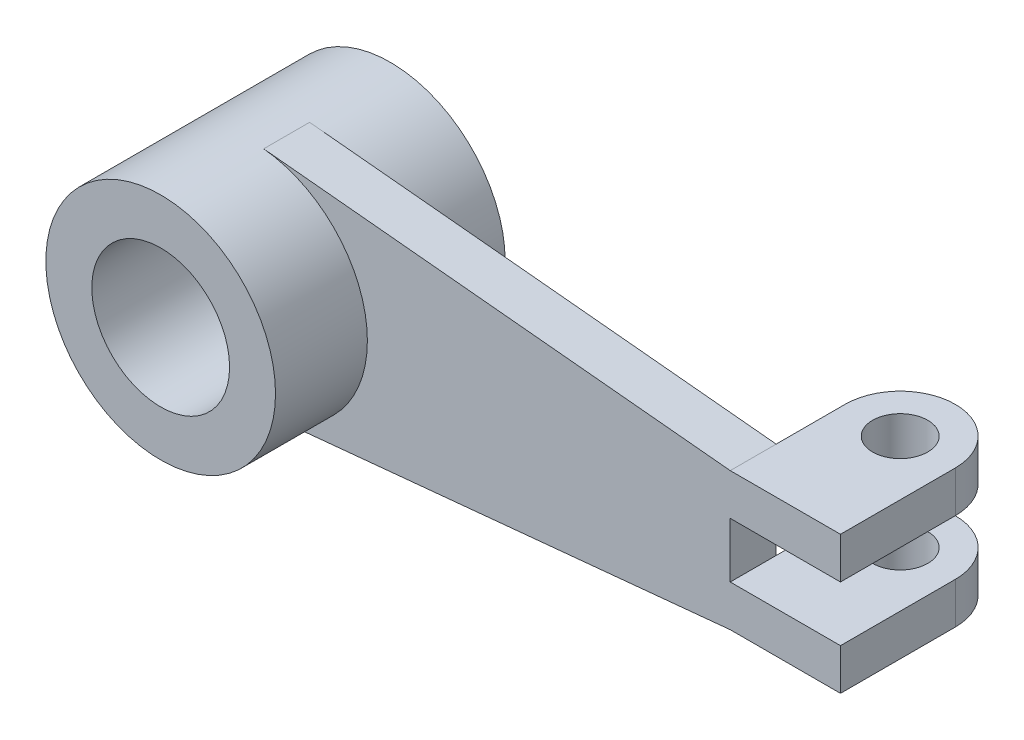
ISO-10303-21;
HEADER;
FILE_DESCRIPTION(('STEP AP214'),'2;1');
FILE_NAME('part.step','',(''),(''),'','','');
FILE_SCHEMA(('AUTOMOTIVE_DESIGN { 1 0 10303 214 1 1 1 1 }'));
ENDSEC;
DATA;
#1=APPLICATION_CONTEXT('core data for automotive mechanical design processes');
#2=APPLICATION_PROTOCOL_DEFINITION('international standard','automotive_design',2000,#1);
#3=PRODUCT_CONTEXT('',#1,'mechanical');
#4=PRODUCT('Part','Part','',(#3));
#5=PRODUCT_RELATED_PRODUCT_CATEGORY('part','',(#4));
#6=PRODUCT_DEFINITION_FORMATION('','',#4);
#7=PRODUCT_DEFINITION_CONTEXT('part definition',#1,'design');
#8=PRODUCT_DEFINITION('design','',#6,#7);
#9=PRODUCT_DEFINITION_SHAPE('','',#8);
#10=(LENGTH_UNIT() NAMED_UNIT(*) SI_UNIT(.MILLI.,.METRE.));
#11=(NAMED_UNIT(*) PLANE_ANGLE_UNIT() SI_UNIT($,.RADIAN.));
#12=(NAMED_UNIT(*) SI_UNIT($,.STERADIAN.) SOLID_ANGLE_UNIT());
#13=UNCERTAINTY_MEASURE_WITH_UNIT(LENGTH_MEASURE(1.E-05),#10,'distance_accuracy_value','');
#14=(GEOMETRIC_REPRESENTATION_CONTEXT(3) GLOBAL_UNCERTAINTY_ASSIGNED_CONTEXT((#13)) GLOBAL_UNIT_ASSIGNED_CONTEXT((#10,
#11,#12)) REPRESENTATION_CONTEXT('',''));
#15=CARTESIAN_POINT('',(0.,0.,0.));
#16=DIRECTION('',(0.,0.,1.));
#17=DIRECTION('',(1.,0.,0.));
#18=AXIS2_PLACEMENT_3D('',#15,#16,#17);
#19=CARTESIAN_POINT('',(104.,15.,-5.));
#20=DIRECTION('',(-1.,0.,0.));
#21=DIRECTION('',(0.,0.,1.));
#22=AXIS2_PLACEMENT_3D('',#19,#20,#21);
#23=PLANE('',#22);
#24=DIRECTION('',(0.,0.,1.));
#25=VECTOR('',#24,1.);
#26=CARTESIAN_POINT('',(104.,-6.,5.));
#27=LINE('',#26,#25);
#28=CARTESIAN_POINT('',(104.,-5.99999999999999,-5.));
#29=VERTEX_POINT('',#28);
#30=CARTESIAN_POINT('',(104.,-5.99999999999999,5.));
#31=VERTEX_POINT('',#30);
#32=EDGE_CURVE('E63',#29,#31,#27,.T.);
#33=ORIENTED_EDGE('',*,*,#32,.F.);
#34=DIRECTION('',(0.,-1.,0.));
#35=VECTOR('',#34,1.);
#36=CARTESIAN_POINT('',(104.,15.,-5.));
#37=LINE('',#36,#35);
#38=CARTESIAN_POINT('',(104.,6.,-5.));
#39=VERTEX_POINT('',#38);
#40=EDGE_CURVE('E237',#39,#29,#37,.T.);
#41=ORIENTED_EDGE('',*,*,#40,.F.);
#42=DIRECTION('',(0.,0.,1.));
#43=VECTOR('',#42,1.);
#44=CARTESIAN_POINT('',(104.,6.,5.));
#45=LINE('',#44,#43);
#46=CARTESIAN_POINT('',(104.,6.,5.));
#47=VERTEX_POINT('',#46);
#48=EDGE_CURVE('E205',#39,#47,#45,.T.);
#49=ORIENTED_EDGE('',*,*,#48,.T.);
#50=DIRECTION('',(0.,-1.,0.));
#51=VECTOR('',#50,1.);
#52=CARTESIAN_POINT('',(104.,15.,5.));
#53=LINE('',#52,#51);
#54=EDGE_CURVE('E68',#47,#31,#53,.T.);
#55=ORIENTED_EDGE('',*,*,#54,.T.);
#56=EDGE_LOOP('',(#33,#41,#49,#55));
#57=FACE_BOUND('',#56,.T.);
#58=ADVANCED_FACE('F45',(#57),#23,.F.);
#59=CARTESIAN_POINT('',(0.,0.,25.));
#60=DIRECTION('',(0.,0.,1.));
#61=DIRECTION('',(1.,0.,0.));
#62=AXIS2_PLACEMENT_3D('',#59,#60,#61);
#63=PLANE('',#62);
#64=CARTESIAN_POINT('',(0.,0.,25.));
#65=DIRECTION('',(0.,0.,1.));
#66=DIRECTION('',(1.,0.,0.));
#67=AXIS2_PLACEMENT_3D('',#64,#65,#66);
#68=CIRCLE('',#67,25.);
#69=CARTESIAN_POINT('',(25.,0.,25.));
#70=VERTEX_POINT('',#69);
#71=EDGE_CURVE('E11',#70,#70,#68,.T.);
#72=ORIENTED_EDGE('',*,*,#71,.T.);
#73=EDGE_LOOP('',(#72));
#74=FACE_BOUND('',#73,.T.);
#75=CARTESIAN_POINT('',(0.,0.,25.));
#76=DIRECTION('',(0.,0.,1.));
#77=DIRECTION('',(1.,0.,0.));
#78=AXIS2_PLACEMENT_3D('',#75,#76,#77);
#79=CIRCLE('',#78,15.);
#80=CARTESIAN_POINT('',(15.,0.,25.));
#81=VERTEX_POINT('',#80);
#82=EDGE_CURVE('E277',#81,#81,#79,.T.);
#83=ORIENTED_EDGE('',*,*,#82,.F.);
#84=EDGE_LOOP('',(#83));
#85=FACE_BOUND('',#84,.T.);
#86=ADVANCED_FACE('F291',(#74,#85),#63,.T.);
#87=CARTESIAN_POINT('',(0.,0.,-25.));
#88=DIRECTION('',(0.,0.,1.));
#89=DIRECTION('',(1.,0.,0.));
#90=AXIS2_PLACEMENT_3D('',#87,#88,#89);
#91=PLANE('',#90);
#92=CARTESIAN_POINT('',(0.,0.,-25.));
#93=DIRECTION('',(0.,0.,1.));
#94=DIRECTION('',(1.,0.,0.));
#95=AXIS2_PLACEMENT_3D('',#92,#93,#94);
#96=CIRCLE('',#95,25.);
#97=CARTESIAN_POINT('',(25.,0.,-25.));
#98=VERTEX_POINT('',#97);
#99=EDGE_CURVE('E55',#98,#98,#96,.T.);
#100=ORIENTED_EDGE('',*,*,#99,.F.);
#101=EDGE_LOOP('',(#100));
#102=FACE_BOUND('',#101,.T.);
#103=CARTESIAN_POINT('',(0.,0.,-25.));
#104=DIRECTION('',(0.,0.,1.));
#105=DIRECTION('',(1.,0.,0.));
#106=AXIS2_PLACEMENT_3D('',#103,#104,#105);
#107=CIRCLE('',#106,15.);
#108=CARTESIAN_POINT('',(15.,0.,-25.));
#109=VERTEX_POINT('',#108);
#110=EDGE_CURVE('E276',#109,#109,#107,.T.);
#111=ORIENTED_EDGE('',*,*,#110,.T.);
#112=EDGE_LOOP('',(#111));
#113=FACE_BOUND('',#112,.T.);
#114=ADVANCED_FACE('F288',(#102,#113),#91,.F.);
#115=CARTESIAN_POINT('',(0.,0.,25.));
#116=DIRECTION('',(0.,0.,-1.));
#117=DIRECTION('',(-1.,0.,0.));
#118=AXIS2_PLACEMENT_3D('',#115,#116,#117);
#119=CYLINDRICAL_SURFACE('',#118,25.);
#120=DIRECTION('',(0.,0.,1.));
#121=VECTOR('',#120,1.);
#122=CARTESIAN_POINT('',(2.4207904658528,24.8825194367539,-5.));
#123=LINE('',#122,#121);
#124=CARTESIAN_POINT('',(2.4207904658528,24.8825194367539,-5.));
#125=VERTEX_POINT('',#124);
#126=CARTESIAN_POINT('',(2.4207904658528,24.8825194367539,5.));
#127=VERTEX_POINT('',#126);
#128=EDGE_CURVE('E251',#125,#127,#123,.T.);
#129=ORIENTED_EDGE('',*,*,#128,.F.);
#130=CARTESIAN_POINT('',(0.,0.,-5.));
#131=DIRECTION('',(0.,0.,1.));
#132=DIRECTION('',(-1.,0.,0.));
#133=AXIS2_PLACEMENT_3D('',#130,#131,#132);
#134=CIRCLE('',#133,25.);
#135=CARTESIAN_POINT('',(2.4207904658528,-24.8825194367539,-5.));
#136=VERTEX_POINT('',#135);
#137=EDGE_CURVE('E247',#136,#125,#134,.T.);
#138=ORIENTED_EDGE('',*,*,#137,.F.);
#139=DIRECTION('',(0.,0.,1.));
#140=VECTOR('',#139,1.);
#141=CARTESIAN_POINT('',(2.42079046585281,-24.8825194367539,-5.));
#142=LINE('',#141,#140);
#143=CARTESIAN_POINT('',(2.42079046585281,-24.8825194367539,5.));
#144=VERTEX_POINT('',#143);
#145=EDGE_CURVE('E265',#136,#144,#142,.T.);
#146=ORIENTED_EDGE('',*,*,#145,.T.);
#147=CARTESIAN_POINT('',(0.,0.,5.));
#148=DIRECTION('',(0.,0.,1.));
#149=DIRECTION('',(-1.,0.,0.));
#150=AXIS2_PLACEMENT_3D('',#147,#148,#149);
#151=CIRCLE('',#150,25.);
#152=EDGE_CURVE('E238',#144,#127,#151,.T.);
#153=ORIENTED_EDGE('',*,*,#152,.T.);
#154=EDGE_LOOP('',(#129,#138,#146,#153));
#155=FACE_BOUND('',#154,.T.);
#156=ORIENTED_EDGE('',*,*,#71,.F.);
#157=EDGE_LOOP('',(#156));
#158=FACE_BOUND('',#157,.T.);
#159=ORIENTED_EDGE('',*,*,#99,.T.);
#160=EDGE_LOOP('',(#159));
#161=FACE_BOUND('',#160,.T.);
#162=ADVANCED_FACE('F47',(#155,#158,#161),#119,.T.);
#163=CARTESIAN_POINT('',(0.,0.,25.));
#164=DIRECTION('',(0.,0.,-1.));
#165=DIRECTION('',(-1.,0.,0.));
#166=AXIS2_PLACEMENT_3D('',#163,#164,#165);
#167=CYLINDRICAL_SURFACE('',#166,15.);
#168=ORIENTED_EDGE('',*,*,#82,.T.);
#169=EDGE_LOOP('',(#168));
#170=FACE_BOUND('',#169,.T.);
#171=ORIENTED_EDGE('',*,*,#110,.F.);
#172=EDGE_LOOP('',(#171));
#173=FACE_BOUND('',#172,.T.);
#174=ADVANCED_FACE('F294',(#170,#173),#167,.F.);
#175=CARTESIAN_POINT('',(104.,15.,-5.));
#176=DIRECTION('',(-0.0968316186341122,-0.995300777470156,0.));
#177=DIRECTION('',(0.995300777470156,-0.0968316186341122,0.));
#178=AXIS2_PLACEMENT_3D('',#175,#176,#177);
#179=PLANE('',#178);
#180=DIRECTION('',(0.995300777470156,-0.0968316186341122,0.));
#181=VECTOR('',#180,1.);
#182=CARTESIAN_POINT('',(104.,15.,5.));
#183=LINE('',#182,#181);
#184=CARTESIAN_POINT('',(104.,15.,5.));
#185=VERTEX_POINT('',#184);
#186=EDGE_CURVE('E228',#127,#185,#183,.T.);
#187=ORIENTED_EDGE('',*,*,#186,.T.);
#188=DIRECTION('',(0.,0.,1.));
#189=VECTOR('',#188,1.);
#190=CARTESIAN_POINT('',(104.,15.,-5.));
#191=LINE('',#190,#189);
#192=CARTESIAN_POINT('',(104.,15.,-5.));
#193=VERTEX_POINT('',#192);
#194=EDGE_CURVE('E272',#193,#185,#191,.T.);
#195=ORIENTED_EDGE('',*,*,#194,.F.);
#196=DIRECTION('',(0.995300777470156,-0.0968316186341122,0.));
#197=VECTOR('',#196,1.);
#198=CARTESIAN_POINT('',(104.,15.,-5.));
#199=LINE('',#198,#197);
#200=EDGE_CURVE('E234',#125,#193,#199,.T.);
#201=ORIENTED_EDGE('',*,*,#200,.F.);
#202=ORIENTED_EDGE('',*,*,#128,.T.);
#203=EDGE_LOOP('',(#187,#195,#201,#202));
#204=FACE_BOUND('',#203,.T.);
#205=ADVANCED_FACE('F296',(#204),#179,.F.);
#206=CARTESIAN_POINT('',(104.,-15.,-5.));
#207=DIRECTION('',(-0.096831618634112,0.995300777470156,0.));
#208=DIRECTION('',(-0.995300777470156,-0.096831618634112,0.));
#209=AXIS2_PLACEMENT_3D('',#206,#207,#208);
#210=PLANE('',#209);
#211=DIRECTION('',(-0.995300777470156,-0.0968316186341119,0.));
#212=VECTOR('',#211,1.);
#213=CARTESIAN_POINT('',(104.,-15.,5.));
#214=LINE('',#213,#212);
#215=CARTESIAN_POINT('',(104.,-15.,5.));
#216=VERTEX_POINT('',#215);
#217=EDGE_CURVE('E256',#216,#144,#214,.T.);
#218=ORIENTED_EDGE('',*,*,#217,.T.);
#219=ORIENTED_EDGE('',*,*,#145,.F.);
#220=DIRECTION('',(-0.995300777470156,-0.0968316186341119,0.));
#221=VECTOR('',#220,1.);
#222=CARTESIAN_POINT('',(104.,-15.,-5.));
#223=LINE('',#222,#221);
#224=CARTESIAN_POINT('',(104.,-15.,-5.));
#225=VERTEX_POINT('',#224);
#226=EDGE_CURVE('E243',#225,#136,#223,.T.);
#227=ORIENTED_EDGE('',*,*,#226,.F.);
#228=DIRECTION('',(0.,0.,1.));
#229=VECTOR('',#228,1.);
#230=CARTESIAN_POINT('',(104.,-15.,-5.));
#231=LINE('',#230,#229);
#232=EDGE_CURVE('E268',#225,#216,#231,.T.);
#233=ORIENTED_EDGE('',*,*,#232,.T.);
#234=EDGE_LOOP('',(#218,#219,#227,#233));
#235=FACE_BOUND('',#234,.T.);
#236=ADVANCED_FACE('F303',(#235),#210,.F.);
#237=CARTESIAN_POINT('',(0.,0.,-5.));
#238=DIRECTION('',(0.,0.,-1.));
#239=DIRECTION('',(-1.,0.,0.));
#240=AXIS2_PLACEMENT_3D('',#237,#238,#239);
#241=PLANE('',#240);
#242=ORIENTED_EDGE('',*,*,#200,.T.);
#243=EDGE_CURVE('E239',#193,#39,#37,.T.);
#244=ORIENTED_EDGE('',*,*,#243,.T.);
#245=ORIENTED_EDGE('',*,*,#40,.T.);
#246=DIRECTION('',(0.,-1.,0.));
#247=VECTOR('',#246,1.);
#248=CARTESIAN_POINT('',(104.,0.,-5.));
#249=LINE('',#248,#247);
#250=EDGE_CURVE('E160',#29,#225,#249,.T.);
#251=ORIENTED_EDGE('',*,*,#250,.T.);
#252=ORIENTED_EDGE('',*,*,#226,.T.);
#253=ORIENTED_EDGE('',*,*,#137,.T.);
#254=EDGE_LOOP('',(#242,#244,#245,#251,#252,#253));
#255=FACE_BOUND('',#254,.T.);
#256=ADVANCED_FACE('F318',(#255),#241,.T.);
#257=CARTESIAN_POINT('',(0.,0.,5.));
#258=DIRECTION('',(0.,0.,-1.));
#259=DIRECTION('',(-1.,0.,0.));
#260=AXIS2_PLACEMENT_3D('',#257,#258,#259);
#261=PLANE('',#260);
#262=ORIENTED_EDGE('',*,*,#186,.F.);
#263=ORIENTED_EDGE('',*,*,#152,.F.);
#264=ORIENTED_EDGE('',*,*,#217,.F.);
#265=DIRECTION('',(1.,0.,0.));
#266=VECTOR('',#265,1.);
#267=CARTESIAN_POINT('',(104.,-15.,5.));
#268=LINE('',#267,#266);
#269=CARTESIAN_POINT('',(128.,-15.,5.));
#270=VERTEX_POINT('',#269);
#271=EDGE_CURVE('E170',#216,#270,#268,.T.);
#272=ORIENTED_EDGE('',*,*,#271,.T.);
#273=DIRECTION('',(0.,-1.,0.));
#274=VECTOR('',#273,1.);
#275=CARTESIAN_POINT('',(128.,-6.,5.));
#276=LINE('',#275,#274);
#277=CARTESIAN_POINT('',(128.,-6.,5.));
#278=VERTEX_POINT('',#277);
#279=EDGE_CURVE('E183',#278,#270,#276,.T.);
#280=ORIENTED_EDGE('',*,*,#279,.F.);
#281=DIRECTION('',(1.,0.,0.));
#282=VECTOR('',#281,1.);
#283=CARTESIAN_POINT('',(104.,-6.,5.));
#284=LINE('',#283,#282);
#285=EDGE_CURVE('E164',#31,#278,#284,.T.);
#286=ORIENTED_EDGE('',*,*,#285,.F.);
#287=ORIENTED_EDGE('',*,*,#54,.F.);
#288=DIRECTION('',(1.,0.,0.));
#289=VECTOR('',#288,1.);
#290=CARTESIAN_POINT('',(104.,6.,5.));
#291=LINE('',#290,#289);
#292=CARTESIAN_POINT('',(128.,6.,5.));
#293=VERTEX_POINT('',#292);
#294=EDGE_CURVE('E192',#47,#293,#291,.T.);
#295=ORIENTED_EDGE('',*,*,#294,.T.);
#296=DIRECTION('',(0.,1.,0.));
#297=VECTOR('',#296,1.);
#298=CARTESIAN_POINT('',(128.,6.,5.));
#299=LINE('',#298,#297);
#300=CARTESIAN_POINT('',(128.,15.,5.));
#301=VERTEX_POINT('',#300);
#302=EDGE_CURVE('E210',#293,#301,#299,.T.);
#303=ORIENTED_EDGE('',*,*,#302,.T.);
#304=DIRECTION('',(1.,0.,0.));
#305=VECTOR('',#304,1.);
#306=CARTESIAN_POINT('',(104.,15.,5.));
#307=LINE('',#306,#305);
#308=EDGE_CURVE('E191',#185,#301,#307,.T.);
#309=ORIENTED_EDGE('',*,*,#308,.F.);
#310=EDGE_LOOP('',(#262,#263,#264,#272,#280,#286,#287,#295,#303,#309));
#311=FACE_BOUND('',#310,.T.);
#312=ADVANCED_FACE('F320',(#311),#261,.F.);
#313=CARTESIAN_POINT('',(104.,6.,5.));
#314=DIRECTION('',(-1.,0.,0.));
#315=DIRECTION('',(0.,0.,1.));
#316=AXIS2_PLACEMENT_3D('',#313,#314,#315);
#317=PLANE('',#316);
#318=CARTESIAN_POINT('',(104.,6.,-20.));
#319=VERTEX_POINT('',#318);
#320=EDGE_CURVE('E206',#319,#39,#45,.T.);
#321=ORIENTED_EDGE('',*,*,#320,.T.);
#322=ORIENTED_EDGE('',*,*,#243,.F.);
#323=DIRECTION('',(0.,0.,1.));
#324=VECTOR('',#323,1.);
#325=CARTESIAN_POINT('',(104.,15.,5.));
#326=LINE('',#325,#324);
#327=CARTESIAN_POINT('',(104.,15.,-20.));
#328=VERTEX_POINT('',#327);
#329=EDGE_CURVE('E197',#328,#193,#326,.T.);
#330=ORIENTED_EDGE('',*,*,#329,.F.);
#331=DIRECTION('',(0.,1.,0.));
#332=VECTOR('',#331,1.);
#333=CARTESIAN_POINT('',(104.,6.,-20.));
#334=LINE('',#333,#332);
#335=EDGE_CURVE('E225',#319,#328,#334,.T.);
#336=ORIENTED_EDGE('',*,*,#335,.F.);
#337=EDGE_LOOP('',(#321,#322,#330,#336));
#338=FACE_BOUND('',#337,.T.);
#339=ADVANCED_FACE('F323',(#338),#317,.T.);
#340=CARTESIAN_POINT('',(116.,6.,-20.));
#341=DIRECTION('',(0.,1.,0.));
#342=DIRECTION('',(0.,0.,1.));
#343=AXIS2_PLACEMENT_3D('',#340,#341,#342);
#344=CYLINDRICAL_SURFACE('',#343,12.);
#345=CARTESIAN_POINT('',(116.,15.,-20.));
#346=DIRECTION('',(0.,1.,0.));
#347=DIRECTION('',(0.,0.,1.));
#348=AXIS2_PLACEMENT_3D('',#345,#346,#347);
#349=CIRCLE('',#348,12.);
#350=CARTESIAN_POINT('',(128.,15.,-20.));
#351=VERTEX_POINT('',#350);
#352=EDGE_CURVE('E218',#351,#328,#349,.T.);
#353=ORIENTED_EDGE('',*,*,#352,.F.);
#354=DIRECTION('',(0.,1.,0.));
#355=VECTOR('',#354,1.);
#356=CARTESIAN_POINT('',(128.,6.,-20.));
#357=LINE('',#356,#355);
#358=CARTESIAN_POINT('',(128.,6.,-20.));
#359=VERTEX_POINT('',#358);
#360=EDGE_CURVE('E229',#359,#351,#357,.T.);
#361=ORIENTED_EDGE('',*,*,#360,.F.);
#362=CARTESIAN_POINT('',(116.,6.,-20.));
#363=DIRECTION('',(0.,1.,0.));
#364=DIRECTION('',(0.,0.,1.));
#365=AXIS2_PLACEMENT_3D('',#362,#363,#364);
#366=CIRCLE('',#365,12.);
#367=EDGE_CURVE('E201',#359,#319,#366,.T.);
#368=ORIENTED_EDGE('',*,*,#367,.T.);
#369=ORIENTED_EDGE('',*,*,#335,.T.);
#370=EDGE_LOOP('',(#353,#361,#368,#369));
#371=FACE_BOUND('',#370,.T.);
#372=ADVANCED_FACE('F331',(#371),#344,.T.);
#373=CARTESIAN_POINT('',(128.,6.,5.));
#374=DIRECTION('',(1.,0.,0.));
#375=DIRECTION('',(0.,0.,-1.));
#376=AXIS2_PLACEMENT_3D('',#373,#374,#375);
#377=PLANE('',#376);
#378=DIRECTION('',(0.,0.,-1.));
#379=VECTOR('',#378,1.);
#380=CARTESIAN_POINT('',(128.,15.,5.));
#381=LINE('',#380,#379);
#382=EDGE_CURVE('E214',#301,#351,#381,.T.);
#383=ORIENTED_EDGE('',*,*,#382,.F.);
#384=ORIENTED_EDGE('',*,*,#302,.F.);
#385=DIRECTION('',(0.,0.,-1.));
#386=VECTOR('',#385,1.);
#387=CARTESIAN_POINT('',(128.,6.,5.));
#388=LINE('',#387,#386);
#389=EDGE_CURVE('E196',#293,#359,#388,.T.);
#390=ORIENTED_EDGE('',*,*,#389,.T.);
#391=ORIENTED_EDGE('',*,*,#360,.T.);
#392=EDGE_LOOP('',(#383,#384,#390,#391));
#393=FACE_BOUND('',#392,.T.);
#394=ADVANCED_FACE('F328',(#393),#377,.T.);
#395=CARTESIAN_POINT('',(116.,6.,-20.));
#396=DIRECTION('',(0.,1.,0.));
#397=DIRECTION('',(0.,0.,1.));
#398=AXIS2_PLACEMENT_3D('',#395,#396,#397);
#399=PLANE('',#398);
#400=CARTESIAN_POINT('',(116.,6.,-20.));
#401=DIRECTION('',(0.,1.,0.));
#402=DIRECTION('',(0.,0.,1.));
#403=AXIS2_PLACEMENT_3D('',#400,#401,#402);
#404=CIRCLE('',#403,6.00000000000001);
#405=CARTESIAN_POINT('',(116.,6.,-14.));
#406=VERTEX_POINT('',#405);
#407=EDGE_CURVE('E175',#406,#406,#404,.T.);
#408=ORIENTED_EDGE('',*,*,#407,.T.);
#409=EDGE_LOOP('',(#408));
#410=FACE_BOUND('',#409,.T.);
#411=ORIENTED_EDGE('',*,*,#294,.F.);
#412=ORIENTED_EDGE('',*,*,#48,.F.);
#413=ORIENTED_EDGE('',*,*,#320,.F.);
#414=ORIENTED_EDGE('',*,*,#367,.F.);
#415=ORIENTED_EDGE('',*,*,#389,.F.);
#416=EDGE_LOOP('',(#411,#412,#413,#414,#415));
#417=FACE_BOUND('',#416,.T.);
#418=ADVANCED_FACE('F330',(#410,#417),#399,.F.);
#419=CARTESIAN_POINT('',(116.,15.,-20.));
#420=DIRECTION('',(0.,1.,0.));
#421=DIRECTION('',(0.,0.,1.));
#422=AXIS2_PLACEMENT_3D('',#419,#420,#421);
#423=PLANE('',#422);
#424=CARTESIAN_POINT('',(116.,15.,-20.));
#425=DIRECTION('',(0.,1.,0.));
#426=DIRECTION('',(0.,0.,1.));
#427=AXIS2_PLACEMENT_3D('',#424,#425,#426);
#428=CIRCLE('',#427,6.00000000000002);
#429=CARTESIAN_POINT('',(116.,15.,-14.));
#430=VERTEX_POINT('',#429);
#431=EDGE_CURVE('E372',#430,#430,#428,.T.);
#432=ORIENTED_EDGE('',*,*,#431,.F.);
#433=EDGE_LOOP('',(#432));
#434=FACE_BOUND('',#433,.T.);
#435=ORIENTED_EDGE('',*,*,#308,.T.);
#436=ORIENTED_EDGE('',*,*,#382,.T.);
#437=ORIENTED_EDGE('',*,*,#352,.T.);
#438=ORIENTED_EDGE('',*,*,#329,.T.);
#439=ORIENTED_EDGE('',*,*,#194,.T.);
#440=EDGE_LOOP('',(#435,#436,#437,#438,#439));
#441=FACE_BOUND('',#440,.T.);
#442=ADVANCED_FACE('F339',(#434,#441),#423,.T.);
#443=CARTESIAN_POINT('',(128.,-6.,5.));
#444=DIRECTION('',(-1.,0.,0.));
#445=DIRECTION('',(0.,0.,1.));
#446=AXIS2_PLACEMENT_3D('',#443,#444,#445);
#447=PLANE('',#446);
#448=DIRECTION('',(0.,0.,-1.));
#449=VECTOR('',#448,1.);
#450=CARTESIAN_POINT('',(128.,-15.,5.));
#451=LINE('',#450,#449);
#452=CARTESIAN_POINT('',(128.,-15.,-20.));
#453=VERTEX_POINT('',#452);
#454=EDGE_CURVE('E180',#270,#453,#451,.T.);
#455=ORIENTED_EDGE('',*,*,#454,.T.);
#456=DIRECTION('',(0.,-1.,0.));
#457=VECTOR('',#456,1.);
#458=CARTESIAN_POINT('',(128.,-6.,-20.));
#459=LINE('',#458,#457);
#460=CARTESIAN_POINT('',(128.,-6.,-20.));
#461=VERTEX_POINT('',#460);
#462=EDGE_CURVE('E156',#461,#453,#459,.T.);
#463=ORIENTED_EDGE('',*,*,#462,.F.);
#464=DIRECTION('',(0.,0.,-1.));
#465=VECTOR('',#464,1.);
#466=CARTESIAN_POINT('',(128.,-6.,5.));
#467=LINE('',#466,#465);
#468=EDGE_CURVE('E141',#278,#461,#467,.T.);
#469=ORIENTED_EDGE('',*,*,#468,.F.);
#470=ORIENTED_EDGE('',*,*,#279,.T.);
#471=EDGE_LOOP('',(#455,#463,#469,#470));
#472=FACE_BOUND('',#471,.T.);
#473=ADVANCED_FACE('F342',(#472),#447,.F.);
#474=CARTESIAN_POINT('',(116.,-6.,-20.));
#475=DIRECTION('',(0.,-1.,0.));
#476=DIRECTION('',(0.,0.,-1.));
#477=AXIS2_PLACEMENT_3D('',#474,#475,#476);
#478=CYLINDRICAL_SURFACE('',#477,12.);
#479=CARTESIAN_POINT('',(116.,-15.,-20.));
#480=DIRECTION('',(0.,1.,0.));
#481=DIRECTION('',(0.,0.,1.));
#482=AXIS2_PLACEMENT_3D('',#479,#480,#481);
#483=CIRCLE('',#482,12.);
#484=CARTESIAN_POINT('',(104.,-15.,-20.));
#485=VERTEX_POINT('',#484);
#486=EDGE_CURVE('E151',#453,#485,#483,.T.);
#487=ORIENTED_EDGE('',*,*,#486,.T.);
#488=DIRECTION('',(0.,-1.,0.));
#489=VECTOR('',#488,1.);
#490=CARTESIAN_POINT('',(104.,-6.,-20.));
#491=LINE('',#490,#489);
#492=CARTESIAN_POINT('',(104.,-6.,-20.));
#493=VERTEX_POINT('',#492);
#494=EDGE_CURVE('E148',#493,#485,#491,.T.);
#495=ORIENTED_EDGE('',*,*,#494,.F.);
#496=CARTESIAN_POINT('',(116.,-6.,-20.));
#497=DIRECTION('',(0.,1.,0.));
#498=DIRECTION('',(0.,0.,1.));
#499=AXIS2_PLACEMENT_3D('',#496,#497,#498);
#500=CIRCLE('',#499,12.);
#501=EDGE_CURVE('E135',#461,#493,#500,.T.);
#502=ORIENTED_EDGE('',*,*,#501,.F.);
#503=ORIENTED_EDGE('',*,*,#462,.T.);
#504=EDGE_LOOP('',(#487,#495,#502,#503));
#505=FACE_BOUND('',#504,.T.);
#506=ADVANCED_FACE('F149',(#505),#478,.T.);
#507=CARTESIAN_POINT('',(104.,-6.,5.));
#508=DIRECTION('',(1.,0.,0.));
#509=DIRECTION('',(0.,0.,-1.));
#510=AXIS2_PLACEMENT_3D('',#507,#508,#509);
#511=PLANE('',#510);
#512=ORIENTED_EDGE('',*,*,#250,.F.);
#513=EDGE_CURVE('E140',#493,#29,#27,.T.);
#514=ORIENTED_EDGE('',*,*,#513,.F.);
#515=ORIENTED_EDGE('',*,*,#494,.T.);
#516=DIRECTION('',(0.,0.,1.));
#517=VECTOR('',#516,1.);
#518=CARTESIAN_POINT('',(104.,-15.,5.));
#519=LINE('',#518,#517);
#520=EDGE_CURVE('E174',#485,#225,#519,.T.);
#521=ORIENTED_EDGE('',*,*,#520,.T.);
#522=EDGE_LOOP('',(#512,#514,#515,#521));
#523=FACE_BOUND('',#522,.T.);
#524=ADVANCED_FACE('F159',(#523),#511,.F.);
#525=CARTESIAN_POINT('',(116.,-6.,-20.));
#526=DIRECTION('',(0.,-1.,0.));
#527=DIRECTION('',(0.,0.,1.));
#528=AXIS2_PLACEMENT_3D('',#525,#526,#527);
#529=PLANE('',#528);
#530=CARTESIAN_POINT('',(116.,-6.,-20.));
#531=DIRECTION('',(0.,-1.,0.));
#532=DIRECTION('',(0.,0.,-1.));
#533=AXIS2_PLACEMENT_3D('',#530,#531,#532);
#534=CIRCLE('',#533,6.00000000000001);
#535=CARTESIAN_POINT('',(116.,-6.,-26.));
#536=VERTEX_POINT('',#535);
#537=EDGE_CURVE('E49',#536,#536,#534,.T.);
#538=ORIENTED_EDGE('',*,*,#537,.T.);
#539=EDGE_LOOP('',(#538));
#540=FACE_BOUND('',#539,.T.);
#541=ORIENTED_EDGE('',*,*,#285,.T.);
#542=ORIENTED_EDGE('',*,*,#468,.T.);
#543=ORIENTED_EDGE('',*,*,#501,.T.);
#544=ORIENTED_EDGE('',*,*,#513,.T.);
#545=ORIENTED_EDGE('',*,*,#32,.T.);
#546=EDGE_LOOP('',(#541,#542,#543,#544,#545));
#547=FACE_BOUND('',#546,.T.);
#548=ADVANCED_FACE('F138',(#540,#547),#529,.F.);
#549=CARTESIAN_POINT('',(116.,-15.,-20.));
#550=DIRECTION('',(0.,-1.,0.));
#551=DIRECTION('',(0.,0.,1.));
#552=AXIS2_PLACEMENT_3D('',#549,#550,#551);
#553=PLANE('',#552);
#554=CARTESIAN_POINT('',(116.,-15.,-20.));
#555=DIRECTION('',(0.,-1.,0.));
#556=DIRECTION('',(0.,0.,-1.));
#557=AXIS2_PLACEMENT_3D('',#554,#555,#556);
#558=CIRCLE('',#557,6.00000000000001);
#559=CARTESIAN_POINT('',(116.,-15.,-26.));
#560=VERTEX_POINT('',#559);
#561=EDGE_CURVE('E376',#560,#560,#558,.T.);
#562=ORIENTED_EDGE('',*,*,#561,.F.);
#563=EDGE_LOOP('',(#562));
#564=FACE_BOUND('',#563,.T.);
#565=ORIENTED_EDGE('',*,*,#271,.F.);
#566=ORIENTED_EDGE('',*,*,#232,.F.);
#567=ORIENTED_EDGE('',*,*,#520,.F.);
#568=ORIENTED_EDGE('',*,*,#486,.F.);
#569=ORIENTED_EDGE('',*,*,#454,.F.);
#570=EDGE_LOOP('',(#565,#566,#567,#568,#569));
#571=FACE_BOUND('',#570,.T.);
#572=ADVANCED_FACE('F354',(#564,#571),#553,.T.);
#573=CARTESIAN_POINT('',(116.,15.,-20.));
#574=DIRECTION('',(0.,1.,0.));
#575=DIRECTION('',(0.,0.,1.));
#576=AXIS2_PLACEMENT_3D('',#573,#574,#575);
#577=CYLINDRICAL_SURFACE('',#576,6.00000000000001);
#578=ORIENTED_EDGE('',*,*,#561,.T.);
#579=EDGE_LOOP('',(#578));
#580=FACE_BOUND('',#579,.T.);
#581=ORIENTED_EDGE('',*,*,#537,.F.);
#582=EDGE_LOOP('',(#581));
#583=FACE_BOUND('',#582,.T.);
#584=ADVANCED_FACE('F357',(#580,#583),#577,.F.);
#585=ORIENTED_EDGE('',*,*,#431,.T.);
#586=EDGE_LOOP('',(#585));
#587=FACE_BOUND('',#586,.T.);
#588=ORIENTED_EDGE('',*,*,#407,.F.);
#589=EDGE_LOOP('',(#588));
#590=FACE_BOUND('',#589,.T.);
#591=ADVANCED_FACE('F362',(#587,#590),#577,.F.);
#592=CLOSED_SHELL('',(#58,#86,#114,#162,#174,#205,#236,#256,#312,#339,#372,#394,#418,#442,#473,
#506,#524,#548,#572,#584,#591));
#593=MANIFOLD_SOLID_BREP('B2',#592);
#594=ADVANCED_BREP_SHAPE_REPRESENTATION('',(#18,#593),#14);
#595=SHAPE_DEFINITION_REPRESENTATION(#9,#594);
ENDSEC;
END-ISO-10303-21;
